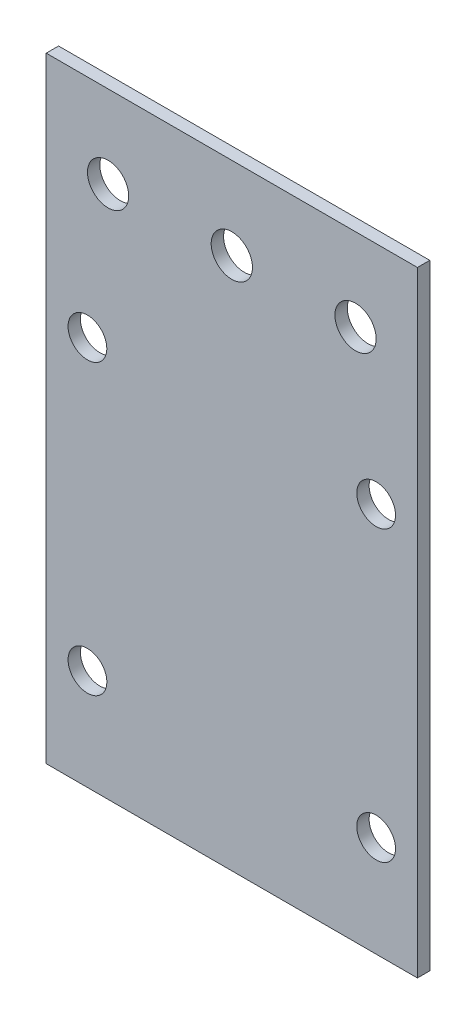
ISO-10303-21;
HEADER;
FILE_DESCRIPTION(('STEP AP214'),'2;1');
FILE_NAME('part.step','',(''),(''),'','','');
FILE_SCHEMA(('AUTOMOTIVE_DESIGN { 1 0 10303 214 1 1 1 1 }'));
ENDSEC;
DATA;
#1=APPLICATION_CONTEXT('core data for automotive mechanical design processes');
#2=APPLICATION_PROTOCOL_DEFINITION('international standard','automotive_design',2000,#1);
#3=PRODUCT_CONTEXT('',#1,'mechanical');
#4=PRODUCT('Part','Part','',(#3));
#5=PRODUCT_RELATED_PRODUCT_CATEGORY('part','',(#4));
#6=PRODUCT_DEFINITION_FORMATION('','',#4);
#7=PRODUCT_DEFINITION_CONTEXT('part definition',#1,'design');
#8=PRODUCT_DEFINITION('design','',#6,#7);
#9=PRODUCT_DEFINITION_SHAPE('','',#8);
#10=(LENGTH_UNIT() NAMED_UNIT(*) SI_UNIT(.MILLI.,.METRE.));
#11=(NAMED_UNIT(*) PLANE_ANGLE_UNIT() SI_UNIT($,.RADIAN.));
#12=(NAMED_UNIT(*) SI_UNIT($,.STERADIAN.) SOLID_ANGLE_UNIT());
#13=UNCERTAINTY_MEASURE_WITH_UNIT(LENGTH_MEASURE(1.E-05),#10,'distance_accuracy_value','');
#14=(GEOMETRIC_REPRESENTATION_CONTEXT(3) GLOBAL_UNCERTAINTY_ASSIGNED_CONTEXT((#13)) GLOBAL_UNIT_ASSIGNED_CONTEXT((#10,
#11,#12)) REPRESENTATION_CONTEXT('',''));
#15=CARTESIAN_POINT('',(0.,0.,0.));
#16=DIRECTION('',(0.,0.,1.));
#17=DIRECTION('',(1.,0.,0.));
#18=AXIS2_PLACEMENT_3D('',#15,#16,#17);
#19=CARTESIAN_POINT('',(-22.5,29.75,1.5));
#20=DIRECTION('',(-1.,0.,0.));
#21=DIRECTION('',(0.,-1.,0.));
#22=AXIS2_PLACEMENT_3D('',#19,#20,#21);
#23=PLANE('',#22);
#24=DIRECTION('',(0.,0.,1.));
#25=VECTOR('',#24,1.);
#26=CARTESIAN_POINT('',(-22.5,44.8461092920442,1.5));
#27=LINE('',#26,#25);
#28=CARTESIAN_POINT('',(-22.5,44.8461092920442,0.));
#29=VERTEX_POINT('',#28);
#30=CARTESIAN_POINT('',(-22.5,44.8461092920442,1.5));
#31=VERTEX_POINT('',#30);
#32=EDGE_CURVE('E11',#29,#31,#27,.T.);
#33=ORIENTED_EDGE('',*,*,#32,.F.);
#34=DIRECTION('',(0.,1.,0.));
#35=VECTOR('',#34,1.);
#36=CARTESIAN_POINT('',(-22.5,0.,0.));
#37=LINE('',#36,#35);
#38=CARTESIAN_POINT('',(-22.5,-29.75,0.));
#39=VERTEX_POINT('',#38);
#40=EDGE_CURVE('E110',#29,#39,#37,.F.);
#41=ORIENTED_EDGE('',*,*,#40,.T.);
#42=DIRECTION('',(0.,0.,1.));
#43=VECTOR('',#42,1.);
#44=CARTESIAN_POINT('',(-22.5,-29.75,1.5));
#45=LINE('',#44,#43);
#46=CARTESIAN_POINT('',(-22.5,-29.75,1.5));
#47=VERTEX_POINT('',#46);
#48=EDGE_CURVE('E52',#39,#47,#45,.T.);
#49=ORIENTED_EDGE('',*,*,#48,.T.);
#50=DIRECTION('',(0.,-1.,0.));
#51=VECTOR('',#50,1.);
#52=CARTESIAN_POINT('',(-22.5,29.75,1.5));
#53=LINE('',#52,#51);
#54=EDGE_CURVE('E132',#31,#47,#53,.T.);
#55=ORIENTED_EDGE('',*,*,#54,.F.);
#56=EDGE_LOOP('',(#33,#41,#49,#55));
#57=FACE_BOUND('',#56,.T.);
#58=ADVANCED_FACE('F42',(#57),#23,.T.);
#59=CARTESIAN_POINT('',(-22.5,-29.75,1.5));
#60=DIRECTION('',(0.,-1.,0.));
#61=DIRECTION('',(1.,0.,0.));
#62=AXIS2_PLACEMENT_3D('',#59,#60,#61);
#63=PLANE('',#62);
#64=ORIENTED_EDGE('',*,*,#48,.F.);
#65=DIRECTION('',(1.,0.,0.));
#66=VECTOR('',#65,1.);
#67=CARTESIAN_POINT('',(0.,-29.75,0.));
#68=LINE('',#67,#66);
#69=CARTESIAN_POINT('',(22.5,-29.75,0.));
#70=VERTEX_POINT('',#69);
#71=EDGE_CURVE('E120',#39,#70,#68,.T.);
#72=ORIENTED_EDGE('',*,*,#71,.T.);
#73=DIRECTION('',(0.,0.,1.));
#74=VECTOR('',#73,1.);
#75=CARTESIAN_POINT('',(22.5,-29.75,1.5));
#76=LINE('',#75,#74);
#77=CARTESIAN_POINT('',(22.5,-29.75,1.5));
#78=VERTEX_POINT('',#77);
#79=EDGE_CURVE('E64',#70,#78,#76,.T.);
#80=ORIENTED_EDGE('',*,*,#79,.T.);
#81=DIRECTION('',(1.,0.,0.));
#82=VECTOR('',#81,1.);
#83=CARTESIAN_POINT('',(-22.5,-29.75,1.5));
#84=LINE('',#83,#82);
#85=EDGE_CURVE('E137',#47,#78,#84,.T.);
#86=ORIENTED_EDGE('',*,*,#85,.F.);
#87=EDGE_LOOP('',(#64,#72,#80,#86));
#88=FACE_BOUND('',#87,.T.);
#89=ADVANCED_FACE('F139',(#88),#63,.T.);
#90=CARTESIAN_POINT('',(22.5,44.8461092920442,1.5));
#91=DIRECTION('',(1.,0.,0.));
#92=DIRECTION('',(0.,1.,0.));
#93=AXIS2_PLACEMENT_3D('',#90,#91,#92);
#94=PLANE('',#93);
#95=ORIENTED_EDGE('',*,*,#79,.F.);
#96=DIRECTION('',(0.,1.,0.));
#97=VECTOR('',#96,1.);
#98=CARTESIAN_POINT('',(22.5,0.,0.));
#99=LINE('',#98,#97);
#100=CARTESIAN_POINT('',(22.5,44.8461092920442,0.));
#101=VERTEX_POINT('',#100);
#102=EDGE_CURVE('E109',#70,#101,#99,.T.);
#103=ORIENTED_EDGE('',*,*,#102,.T.);
#104=DIRECTION('',(0.,0.,1.));
#105=VECTOR('',#104,1.);
#106=CARTESIAN_POINT('',(22.5,44.8461092920442,1.5));
#107=LINE('',#106,#105);
#108=CARTESIAN_POINT('',(22.5,44.8461092920442,1.5));
#109=VERTEX_POINT('',#108);
#110=EDGE_CURVE('E46',#101,#109,#107,.T.);
#111=ORIENTED_EDGE('',*,*,#110,.T.);
#112=DIRECTION('',(0.,1.,0.));
#113=VECTOR('',#112,1.);
#114=CARTESIAN_POINT('',(22.5,44.8461092920442,1.5));
#115=LINE('',#114,#113);
#116=EDGE_CURVE('E176',#78,#109,#115,.T.);
#117=ORIENTED_EDGE('',*,*,#116,.F.);
#118=EDGE_LOOP('',(#95,#103,#111,#117));
#119=FACE_BOUND('',#118,.T.);
#120=ADVANCED_FACE('F112',(#119),#94,.T.);
#121=CARTESIAN_POINT('',(17.4962442912336,-17.5043716551175,1.5));
#122=DIRECTION('',(0.,0.,1.));
#123=DIRECTION('',(1.,0.,0.));
#124=AXIS2_PLACEMENT_3D('',#121,#122,#123);
#125=CYLINDRICAL_SURFACE('',#124,2.35048094716167);
#126=CARTESIAN_POINT('',(17.4962442912336,-17.5043716551175,1.5));
#127=DIRECTION('',(0.,0.,1.));
#128=DIRECTION('',(1.,0.,0.));
#129=AXIS2_PLACEMENT_3D('',#126,#127,#128);
#130=CIRCLE('',#129,2.35048094716167);
#131=CARTESIAN_POINT('',(19.8467252383953,-17.5043716551175,1.5));
#132=VERTEX_POINT('',#131);
#133=EDGE_CURVE('E129',#132,#132,#130,.T.);
#134=ORIENTED_EDGE('',*,*,#133,.T.);
#135=EDGE_LOOP('',(#134));
#136=FACE_BOUND('',#135,.T.);
#137=CARTESIAN_POINT('',(17.4962442912336,-17.5043716551175,0.));
#138=DIRECTION('',(0.,0.,1.));
#139=DIRECTION('',(1.,0.,0.));
#140=AXIS2_PLACEMENT_3D('',#137,#138,#139);
#141=CIRCLE('',#140,2.35048094716167);
#142=CARTESIAN_POINT('',(19.8467252383953,-17.5043716551175,0.));
#143=VERTEX_POINT('',#142);
#144=EDGE_CURVE('E116',#143,#143,#141,.T.);
#145=ORIENTED_EDGE('',*,*,#144,.F.);
#146=EDGE_LOOP('',(#145));
#147=FACE_BOUND('',#146,.T.);
#148=ADVANCED_FACE('F333',(#136,#147),#125,.F.);
#149=CARTESIAN_POINT('',(-17.5037557087664,17.4956283448825,1.5));
#150=DIRECTION('',(0.,0.,1.));
#151=DIRECTION('',(1.,0.,0.));
#152=AXIS2_PLACEMENT_3D('',#149,#150,#151);
#153=CYLINDRICAL_SURFACE('',#152,2.35048094716167);
#154=CARTESIAN_POINT('',(-17.5037557087664,17.4956283448825,1.5));
#155=DIRECTION('',(0.,0.,1.));
#156=DIRECTION('',(1.,0.,0.));
#157=AXIS2_PLACEMENT_3D('',#154,#155,#156);
#158=CIRCLE('',#157,2.35048094716167);
#159=CARTESIAN_POINT('',(-15.1532747616047,17.4956283448825,1.5));
#160=VERTEX_POINT('',#159);
#161=EDGE_CURVE('E173',#160,#160,#158,.T.);
#162=ORIENTED_EDGE('',*,*,#161,.T.);
#163=EDGE_LOOP('',(#162));
#164=FACE_BOUND('',#163,.T.);
#165=CARTESIAN_POINT('',(-17.5037557087664,17.4956283448825,0.));
#166=DIRECTION('',(0.,0.,1.));
#167=DIRECTION('',(1.,0.,0.));
#168=AXIS2_PLACEMENT_3D('',#165,#166,#167);
#169=CIRCLE('',#168,2.35048094716167);
#170=CARTESIAN_POINT('',(-15.1532747616047,17.4956283448825,0.));
#171=VERTEX_POINT('',#170);
#172=EDGE_CURVE('E113',#171,#171,#169,.T.);
#173=ORIENTED_EDGE('',*,*,#172,.F.);
#174=EDGE_LOOP('',(#173));
#175=FACE_BOUND('',#174,.T.);
#176=ADVANCED_FACE('F200',(#164,#175),#153,.F.);
#177=CARTESIAN_POINT('',(-22.5,44.8461092920442,1.5));
#178=DIRECTION('',(0.,1.,0.));
#179=DIRECTION('',(-1.,0.,0.));
#180=AXIS2_PLACEMENT_3D('',#177,#178,#179);
#181=PLANE('',#180);
#182=DIRECTION('',(1.,0.,0.));
#183=VECTOR('',#182,1.);
#184=CARTESIAN_POINT('',(0.,44.8461092920442,0.));
#185=LINE('',#184,#183);
#186=EDGE_CURVE('E97',#101,#29,#185,.F.);
#187=ORIENTED_EDGE('',*,*,#186,.T.);
#188=ORIENTED_EDGE('',*,*,#32,.T.);
#189=DIRECTION('',(-1.,0.,0.));
#190=VECTOR('',#189,1.);
#191=CARTESIAN_POINT('',(-22.5,44.8461092920442,1.5));
#192=LINE('',#191,#190);
#193=EDGE_CURVE('E99',#109,#31,#192,.T.);
#194=ORIENTED_EDGE('',*,*,#193,.F.);
#195=ORIENTED_EDGE('',*,*,#110,.F.);
#196=EDGE_LOOP('',(#187,#188,#194,#195));
#197=FACE_BOUND('',#196,.T.);
#198=ADVANCED_FACE('F96',(#197),#181,.T.);
#199=CARTESIAN_POINT('',(17.4962442912336,17.4956283448825,1.5));
#200=DIRECTION('',(0.,0.,1.));
#201=DIRECTION('',(1.,0.,0.));
#202=AXIS2_PLACEMENT_3D('',#199,#200,#201);
#203=CYLINDRICAL_SURFACE('',#202,2.35048094716167);
#204=CARTESIAN_POINT('',(17.4962442912336,17.4956283448825,1.5));
#205=DIRECTION('',(0.,0.,1.));
#206=DIRECTION('',(1.,0.,0.));
#207=AXIS2_PLACEMENT_3D('',#204,#205,#206);
#208=CIRCLE('',#207,2.35048094716167);
#209=CARTESIAN_POINT('',(19.8467252383953,17.4956283448825,1.5));
#210=VERTEX_POINT('',#209);
#211=EDGE_CURVE('E140',#210,#210,#208,.T.);
#212=ORIENTED_EDGE('',*,*,#211,.T.);
#213=EDGE_LOOP('',(#212));
#214=FACE_BOUND('',#213,.T.);
#215=CARTESIAN_POINT('',(17.4962442912336,17.4956283448825,0.));
#216=DIRECTION('',(0.,0.,1.));
#217=DIRECTION('',(1.,0.,0.));
#218=AXIS2_PLACEMENT_3D('',#215,#216,#217);
#219=CIRCLE('',#218,2.35048094716167);
#220=CARTESIAN_POINT('',(19.8467252383953,17.4956283448825,0.));
#221=VERTEX_POINT('',#220);
#222=EDGE_CURVE('E122',#221,#221,#219,.T.);
#223=ORIENTED_EDGE('',*,*,#222,.F.);
#224=EDGE_LOOP('',(#223));
#225=FACE_BOUND('',#224,.T.);
#226=ADVANCED_FACE('F213',(#214,#225),#203,.F.);
#227=CARTESIAN_POINT('',(-17.5,-17.5,1.5));
#228=DIRECTION('',(0.,0.,1.));
#229=DIRECTION('',(1.,0.,0.));
#230=AXIS2_PLACEMENT_3D('',#227,#228,#229);
#231=CYLINDRICAL_SURFACE('',#230,2.35048094716167);
#232=CARTESIAN_POINT('',(-17.5,-17.5,1.5));
#233=DIRECTION('',(0.,0.,1.));
#234=DIRECTION('',(1.,0.,0.));
#235=AXIS2_PLACEMENT_3D('',#232,#233,#234);
#236=CIRCLE('',#235,2.35048094716167);
#237=CARTESIAN_POINT('',(-15.1495190528384,-17.5,1.5));
#238=VERTEX_POINT('',#237);
#239=EDGE_CURVE('E103',#238,#238,#236,.T.);
#240=ORIENTED_EDGE('',*,*,#239,.T.);
#241=EDGE_LOOP('',(#240));
#242=FACE_BOUND('',#241,.T.);
#243=CARTESIAN_POINT('',(-17.5,-17.5,0.));
#244=DIRECTION('',(0.,0.,1.));
#245=DIRECTION('',(1.,0.,0.));
#246=AXIS2_PLACEMENT_3D('',#243,#244,#245);
#247=CIRCLE('',#246,2.35048094716167);
#248=CARTESIAN_POINT('',(-15.1495190528384,-17.5,0.));
#249=VERTEX_POINT('',#248);
#250=EDGE_CURVE('E126',#249,#249,#247,.T.);
#251=ORIENTED_EDGE('',*,*,#250,.F.);
#252=EDGE_LOOP('',(#251));
#253=FACE_BOUND('',#252,.T.);
#254=ADVANCED_FACE('F44',(#242,#253),#231,.F.);
#255=CARTESIAN_POINT('',(0.,0.,1.5));
#256=DIRECTION('',(0.,0.,1.));
#257=DIRECTION('',(1.,0.,0.));
#258=AXIS2_PLACEMENT_3D('',#255,#256,#257);
#259=PLANE('',#258);
#260=CARTESIAN_POINT('',(-15.,34.8461092920442,1.5));
#261=DIRECTION('',(0.,0.,1.));
#262=DIRECTION('',(1.,0.,0.));
#263=AXIS2_PLACEMENT_3D('',#260,#261,#262);
#264=CIRCLE('',#263,2.5);
#265=CARTESIAN_POINT('',(-12.5,34.8461092920442,1.5));
#266=VERTEX_POINT('',#265);
#267=EDGE_CURVE('E152',#266,#266,#264,.T.);
#268=ORIENTED_EDGE('',*,*,#267,.F.);
#269=EDGE_LOOP('',(#268));
#270=FACE_BOUND('',#269,.T.);
#271=CARTESIAN_POINT('',(0.,34.8461092920442,1.5));
#272=DIRECTION('',(0.,0.,1.));
#273=DIRECTION('',(1.,0.,0.));
#274=AXIS2_PLACEMENT_3D('',#271,#272,#273);
#275=CIRCLE('',#274,2.5);
#276=CARTESIAN_POINT('',(2.49999999999998,34.8461092920442,1.5));
#277=VERTEX_POINT('',#276);
#278=EDGE_CURVE('E160',#277,#277,#275,.T.);
#279=ORIENTED_EDGE('',*,*,#278,.F.);
#280=EDGE_LOOP('',(#279));
#281=FACE_BOUND('',#280,.T.);
#282=CARTESIAN_POINT('',(15.,34.8461092920442,1.5));
#283=DIRECTION('',(0.,0.,1.));
#284=DIRECTION('',(1.,0.,0.));
#285=AXIS2_PLACEMENT_3D('',#282,#283,#284);
#286=CIRCLE('',#285,2.5);
#287=CARTESIAN_POINT('',(17.5,34.8461092920442,1.5));
#288=VERTEX_POINT('',#287);
#289=EDGE_CURVE('E166',#288,#288,#286,.T.);
#290=ORIENTED_EDGE('',*,*,#289,.F.);
#291=EDGE_LOOP('',(#290));
#292=FACE_BOUND('',#291,.T.);
#293=ORIENTED_EDGE('',*,*,#133,.F.);
#294=EDGE_LOOP('',(#293));
#295=FACE_BOUND('',#294,.T.);
#296=ORIENTED_EDGE('',*,*,#161,.F.);
#297=EDGE_LOOP('',(#296));
#298=FACE_BOUND('',#297,.T.);
#299=ORIENTED_EDGE('',*,*,#116,.T.);
#300=ORIENTED_EDGE('',*,*,#193,.T.);
#301=ORIENTED_EDGE('',*,*,#54,.T.);
#302=ORIENTED_EDGE('',*,*,#85,.T.);
#303=EDGE_LOOP('',(#299,#300,#301,#302));
#304=FACE_BOUND('',#303,.T.);
#305=ORIENTED_EDGE('',*,*,#211,.F.);
#306=EDGE_LOOP('',(#305));
#307=FACE_BOUND('',#306,.T.);
#308=ORIENTED_EDGE('',*,*,#239,.F.);
#309=EDGE_LOOP('',(#308));
#310=FACE_BOUND('',#309,.T.);
#311=ADVANCED_FACE('F135',(#270,#281,#292,#295,#298,#304,#307,#310),#259,.T.);
#312=CARTESIAN_POINT('',(0.,0.,0.));
#313=DIRECTION('',(0.,0.,1.));
#314=DIRECTION('',(1.,0.,0.));
#315=AXIS2_PLACEMENT_3D('',#312,#313,#314);
#316=PLANE('',#315);
#317=CARTESIAN_POINT('',(-15.,34.8461092920442,0.));
#318=DIRECTION('',(0.,0.,1.));
#319=DIRECTION('',(1.,0.,0.));
#320=AXIS2_PLACEMENT_3D('',#317,#318,#319);
#321=CIRCLE('',#320,2.5);
#322=CARTESIAN_POINT('',(-12.5,34.8461092920442,0.));
#323=VERTEX_POINT('',#322);
#324=EDGE_CURVE('E148',#323,#323,#321,.F.);
#325=ORIENTED_EDGE('',*,*,#324,.F.);
#326=EDGE_LOOP('',(#325));
#327=FACE_BOUND('',#326,.T.);
#328=CARTESIAN_POINT('',(0.,34.8461092920442,0.));
#329=DIRECTION('',(0.,0.,1.));
#330=DIRECTION('',(1.,0.,0.));
#331=AXIS2_PLACEMENT_3D('',#328,#329,#330);
#332=CIRCLE('',#331,2.5);
#333=CARTESIAN_POINT('',(2.49999999999998,34.8461092920442,0.));
#334=VERTEX_POINT('',#333);
#335=EDGE_CURVE('E157',#334,#334,#332,.F.);
#336=ORIENTED_EDGE('',*,*,#335,.F.);
#337=EDGE_LOOP('',(#336));
#338=FACE_BOUND('',#337,.T.);
#339=CARTESIAN_POINT('',(15.,34.8461092920442,0.));
#340=DIRECTION('',(0.,0.,1.));
#341=DIRECTION('',(1.,0.,0.));
#342=AXIS2_PLACEMENT_3D('',#339,#340,#341);
#343=CIRCLE('',#342,2.5);
#344=CARTESIAN_POINT('',(17.5,34.8461092920442,0.));
#345=VERTEX_POINT('',#344);
#346=EDGE_CURVE('E163',#345,#345,#343,.F.);
#347=ORIENTED_EDGE('',*,*,#346,.F.);
#348=EDGE_LOOP('',(#347));
#349=FACE_BOUND('',#348,.T.);
#350=ORIENTED_EDGE('',*,*,#144,.T.);
#351=EDGE_LOOP('',(#350));
#352=FACE_BOUND('',#351,.T.);
#353=ORIENTED_EDGE('',*,*,#172,.T.);
#354=EDGE_LOOP('',(#353));
#355=FACE_BOUND('',#354,.T.);
#356=ORIENTED_EDGE('',*,*,#102,.F.);
#357=ORIENTED_EDGE('',*,*,#71,.F.);
#358=ORIENTED_EDGE('',*,*,#40,.F.);
#359=ORIENTED_EDGE('',*,*,#186,.F.);
#360=EDGE_LOOP('',(#356,#357,#358,#359));
#361=FACE_BOUND('',#360,.T.);
#362=ORIENTED_EDGE('',*,*,#222,.T.);
#363=EDGE_LOOP('',(#362));
#364=FACE_BOUND('',#363,.T.);
#365=ORIENTED_EDGE('',*,*,#250,.T.);
#366=EDGE_LOOP('',(#365));
#367=FACE_BOUND('',#366,.T.);
#368=ADVANCED_FACE('F106',(#327,#338,#349,#352,#355,#361,#364,#367),#316,.F.);
#369=CARTESIAN_POINT('',(15.,34.8461092920442,-0.000999999999999916));
#370=DIRECTION('',(0.,0.,1.));
#371=DIRECTION('',(1.,0.,0.));
#372=AXIS2_PLACEMENT_3D('',#369,#370,#371);
#373=CYLINDRICAL_SURFACE('',#372,2.5);
#374=ORIENTED_EDGE('',*,*,#289,.T.);
#375=EDGE_LOOP('',(#374));
#376=FACE_BOUND('',#375,.T.);
#377=ORIENTED_EDGE('',*,*,#346,.T.);
#378=EDGE_LOOP('',(#377));
#379=FACE_BOUND('',#378,.T.);
#380=ADVANCED_FACE('F210',(#376,#379),#373,.F.);
#381=CARTESIAN_POINT('',(0.,34.8461092920442,-0.000999999999999916));
#382=DIRECTION('',(0.,0.,1.));
#383=DIRECTION('',(1.,0.,0.));
#384=AXIS2_PLACEMENT_3D('',#381,#382,#383);
#385=CYLINDRICAL_SURFACE('',#384,2.5);
#386=ORIENTED_EDGE('',*,*,#278,.T.);
#387=EDGE_LOOP('',(#386));
#388=FACE_BOUND('',#387,.T.);
#389=ORIENTED_EDGE('',*,*,#335,.T.);
#390=EDGE_LOOP('',(#389));
#391=FACE_BOUND('',#390,.T.);
#392=ADVANCED_FACE('F272',(#388,#391),#385,.F.);
#393=CARTESIAN_POINT('',(-15.,34.8461092920442,-0.000999999999999916));
#394=DIRECTION('',(0.,0.,1.));
#395=DIRECTION('',(1.,0.,0.));
#396=AXIS2_PLACEMENT_3D('',#393,#394,#395);
#397=CYLINDRICAL_SURFACE('',#396,2.5);
#398=ORIENTED_EDGE('',*,*,#267,.T.);
#399=EDGE_LOOP('',(#398));
#400=FACE_BOUND('',#399,.T.);
#401=ORIENTED_EDGE('',*,*,#324,.T.);
#402=EDGE_LOOP('',(#401));
#403=FACE_BOUND('',#402,.T.);
#404=ADVANCED_FACE('F282',(#400,#403),#397,.F.);
#405=CLOSED_SHELL('',(#58,#89,#120,#148,#176,#198,#226,#254,#311,#368,#380,#392,#404));
#406=MANIFOLD_SOLID_BREP('B2',#405);
#407=ADVANCED_BREP_SHAPE_REPRESENTATION('',(#18,#406),#14);
#408=SHAPE_DEFINITION_REPRESENTATION(#9,#407);
ENDSEC;
END-ISO-10303-21;
